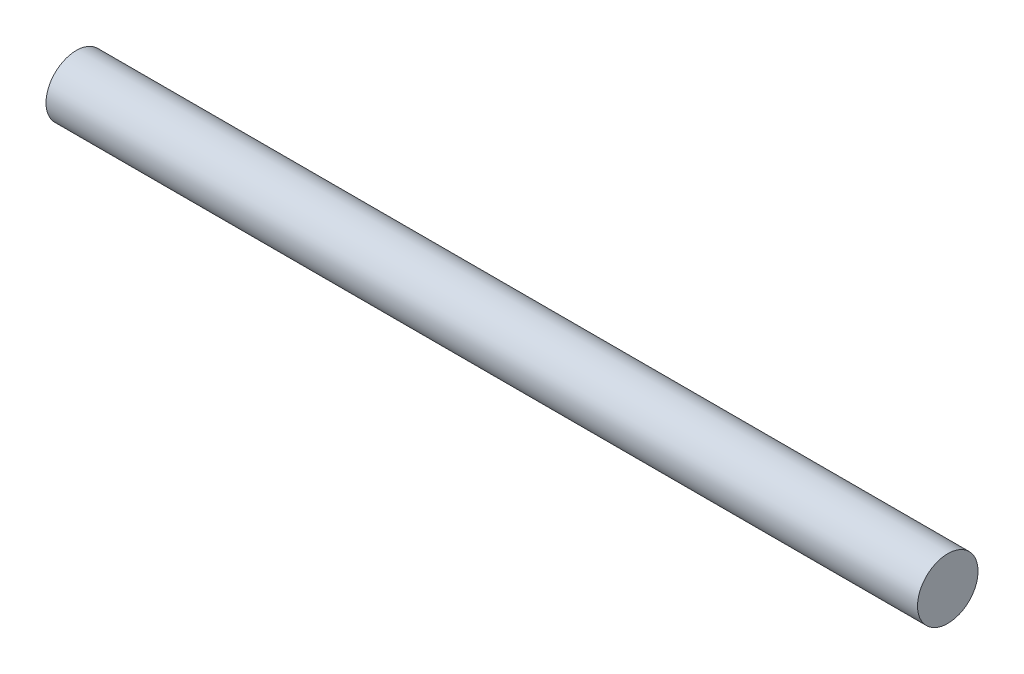
ISO-10303-21;
HEADER;
FILE_DESCRIPTION(('STEP AP214'),'2;1');
FILE_NAME('part.step','',(''),(''),'','','');
FILE_SCHEMA(('AUTOMOTIVE_DESIGN { 1 0 10303 214 1 1 1 1 }'));
ENDSEC;
DATA;
#1=APPLICATION_CONTEXT('core data for automotive mechanical design processes');
#2=APPLICATION_PROTOCOL_DEFINITION('international standard','automotive_design',2000,#1);
#3=PRODUCT_CONTEXT('',#1,'mechanical');
#4=PRODUCT('Part','Part','',(#3));
#5=PRODUCT_RELATED_PRODUCT_CATEGORY('part','',(#4));
#6=PRODUCT_DEFINITION_FORMATION('','',#4);
#7=PRODUCT_DEFINITION_CONTEXT('part definition',#1,'design');
#8=PRODUCT_DEFINITION('design','',#6,#7);
#9=PRODUCT_DEFINITION_SHAPE('','',#8);
#10=(LENGTH_UNIT() NAMED_UNIT(*) SI_UNIT(.MILLI.,.METRE.));
#11=(NAMED_UNIT(*) PLANE_ANGLE_UNIT() SI_UNIT($,.RADIAN.));
#12=(NAMED_UNIT(*) SI_UNIT($,.STERADIAN.) SOLID_ANGLE_UNIT());
#13=UNCERTAINTY_MEASURE_WITH_UNIT(LENGTH_MEASURE(1.E-05),#10,'distance_accuracy_value','');
#14=(GEOMETRIC_REPRESENTATION_CONTEXT(3) GLOBAL_UNCERTAINTY_ASSIGNED_CONTEXT((#13)) GLOBAL_UNIT_ASSIGNED_CONTEXT((#10,
#11,#12)) REPRESENTATION_CONTEXT('',''));
#15=CARTESIAN_POINT('',(0.,0.,0.));
#16=DIRECTION('',(0.,0.,1.));
#17=DIRECTION('',(1.,0.,0.));
#18=AXIS2_PLACEMENT_3D('',#15,#16,#17);
#19=CARTESIAN_POINT('',(720.,0.,0.));
#20=DIRECTION('',(-1.,0.,0.));
#21=DIRECTION('',(0.,0.,1.));
#22=AXIS2_PLACEMENT_3D('',#19,#20,#21);
#23=CYLINDRICAL_SURFACE('',#22,25.);
#24=CARTESIAN_POINT('',(720.,0.,0.));
#25=DIRECTION('',(1.,0.,0.));
#26=DIRECTION('',(0.,0.,-1.));
#27=AXIS2_PLACEMENT_3D('',#24,#25,#26);
#28=CIRCLE('',#27,25.);
#29=CARTESIAN_POINT('',(720.,0.,25.));
#30=VERTEX_POINT('',#29);
#31=EDGE_CURVE('E10',#30,#30,#28,.T.);
#32=CARTESIAN_POINT('',(0.,0.,0.));
#33=DIRECTION('',(1.,0.,0.));
#34=DIRECTION('',(0.,0.,-1.));
#35=AXIS2_PLACEMENT_3D('',#32,#33,#34);
#36=CIRCLE('',#35,25.);
#37=CARTESIAN_POINT('',(-1.11022302462516E-13,0.,25.));
#38=VERTEX_POINT('',#37);
#39=EDGE_CURVE('E36',#38,#38,#36,.T.);
#40=CARTESIAN_POINT('',(720.,0.,25.));
#41=CARTESIAN_POINT('',(712.5,0.,25.));
#42=CARTESIAN_POINT('',(705.,0.,25.));
#43=CARTESIAN_POINT('',(690.,0.,25.));
#44=CARTESIAN_POINT('',(682.5,0.,25.));
#45=CARTESIAN_POINT('',(667.5,0.,25.));
#46=CARTESIAN_POINT('',(660.,0.,25.));
#47=CARTESIAN_POINT('',(645.,0.,25.));
#48=CARTESIAN_POINT('',(637.5,0.,25.));
#49=CARTESIAN_POINT('',(622.5,0.,25.));
#50=CARTESIAN_POINT('',(615.,0.,25.));
#51=CARTESIAN_POINT('',(600.,0.,25.));
#52=CARTESIAN_POINT('',(592.5,0.,25.));
#53=CARTESIAN_POINT('',(577.5,0.,25.));
#54=CARTESIAN_POINT('',(570.,0.,25.));
#55=CARTESIAN_POINT('',(555.,0.,25.));
#56=CARTESIAN_POINT('',(547.5,0.,25.));
#57=CARTESIAN_POINT('',(532.5,0.,25.));
#58=CARTESIAN_POINT('',(525.,0.,25.));
#59=CARTESIAN_POINT('',(510.,0.,25.));
#60=CARTESIAN_POINT('',(502.5,0.,25.));
#61=CARTESIAN_POINT('',(487.5,0.,25.));
#62=CARTESIAN_POINT('',(480.,0.,25.));
#63=CARTESIAN_POINT('',(465.,0.,25.));
#64=CARTESIAN_POINT('',(457.5,0.,25.));
#65=CARTESIAN_POINT('',(442.5,0.,25.));
#66=CARTESIAN_POINT('',(435.,0.,25.));
#67=CARTESIAN_POINT('',(420.,0.,25.));
#68=CARTESIAN_POINT('',(412.5,0.,25.));
#69=CARTESIAN_POINT('',(397.5,0.,25.));
#70=CARTESIAN_POINT('',(390.,0.,25.));
#71=CARTESIAN_POINT('',(375.,0.,25.));
#72=CARTESIAN_POINT('',(367.5,0.,25.));
#73=CARTESIAN_POINT('',(352.5,0.,25.));
#74=CARTESIAN_POINT('',(345.,0.,25.));
#75=CARTESIAN_POINT('',(330.,0.,25.));
#76=CARTESIAN_POINT('',(322.5,0.,25.));
#77=CARTESIAN_POINT('',(307.5,0.,25.));
#78=CARTESIAN_POINT('',(300.,0.,25.));
#79=CARTESIAN_POINT('',(285.,0.,25.));
#80=CARTESIAN_POINT('',(277.5,0.,25.));
#81=CARTESIAN_POINT('',(262.5,0.,25.));
#82=CARTESIAN_POINT('',(255.,0.,25.));
#83=CARTESIAN_POINT('',(240.,0.,25.));
#84=CARTESIAN_POINT('',(232.5,0.,25.));
#85=CARTESIAN_POINT('',(217.5,0.,25.));
#86=CARTESIAN_POINT('',(210.,0.,25.));
#87=CARTESIAN_POINT('',(195.,0.,25.));
#88=CARTESIAN_POINT('',(187.5,0.,25.));
#89=CARTESIAN_POINT('',(172.5,0.,25.));
#90=CARTESIAN_POINT('',(165.,0.,25.));
#91=CARTESIAN_POINT('',(150.,0.,25.));
#92=CARTESIAN_POINT('',(142.5,0.,25.));
#93=CARTESIAN_POINT('',(127.5,0.,25.));
#94=CARTESIAN_POINT('',(120.,0.,25.));
#95=CARTESIAN_POINT('',(105.,0.,25.));
#96=CARTESIAN_POINT('',(97.5,0.,25.));
#97=CARTESIAN_POINT('',(82.4999999999999,0.,25.));
#98=CARTESIAN_POINT('',(74.9999999999999,0.,25.));
#99=CARTESIAN_POINT('',(59.9999999999999,0.,25.));
#100=CARTESIAN_POINT('',(52.4999999999999,0.,25.));
#101=CARTESIAN_POINT('',(37.4999999999999,0.,25.));
#102=CARTESIAN_POINT('',(29.9999999999999,0.,25.));
#103=CARTESIAN_POINT('',(14.9999999999999,0.,25.));
#104=CARTESIAN_POINT('',(7.49999999999989,0.,25.));
#105=CARTESIAN_POINT('',(-1.11022302462516E-13,0.,25.));
#106=B_SPLINE_CURVE_WITH_KNOTS('',3,(#40,#41,#42,#43,#44,#45,#46,#47,#48,#49,#50,#51,#52,#53,
#54,#55,#56,#57,#58,#59,#60,#61,#62,#63,#64,#65,#66,#67,#68,#69,#70,#71,#72,#73,#74,#75,#76,#77,
#78,#79,#80,#81,#82,#83,#84,#85,#86,#87,#88,#89,#90,#91,#92,#93,#94,#95,#96,#97,#98,#99,#100,
#101,#102,#103,#104,#105),.UNSPECIFIED.,.F.,.F.,(4,2,2,2,2,2,2,2,2,2,2,2,2,2,2,2,2,2,2,2,2,2,2,
2,2,2,2,2,2,2,2,2,4),(0.,22.5000000000001,45.,67.5000000000001,90.0000000000001,112.5,135.,
157.5,180.,202.5,225.,247.5,270.,292.5,315.,337.5,360.,382.5,405.,427.5,450.,472.5,495.,517.5,
540.,562.5,585.,607.5,630.,652.5,675.,697.5,720.),.UNSPECIFIED.);
#107=EDGE_CURVE('BSEAM33',#30,#38,#106,.T.);
#108=ORIENTED_EDGE('',*,*,#31,.F.);
#109=ORIENTED_EDGE('',*,*,#39,.T.);
#110=ORIENTED_EDGE('',*,*,#107,.T.);
#111=ORIENTED_EDGE('',*,*,#107,.F.);
#112=EDGE_LOOP('',(#108,#110,#109,#111));
#113=FACE_BOUND('',#112,.T.);
#114=ADVANCED_FACE('F33',(#113),#23,.T.);
#115=CARTESIAN_POINT('',(720.,0.,0.));
#116=DIRECTION('',(1.,0.,0.));
#117=DIRECTION('',(0.,0.,-1.));
#118=AXIS2_PLACEMENT_3D('',#115,#116,#117);
#119=PLANE('',#118);
#120=ORIENTED_EDGE('',*,*,#31,.T.);
#121=EDGE_LOOP('',(#120));
#122=FACE_BOUND('',#121,.T.);
#123=ADVANCED_FACE('F48',(#122),#119,.T.);
#124=CARTESIAN_POINT('',(0.,0.,0.));
#125=DIRECTION('',(1.,0.,0.));
#126=DIRECTION('',(0.,0.,-1.));
#127=AXIS2_PLACEMENT_3D('',#124,#125,#126);
#128=PLANE('',#127);
#129=ORIENTED_EDGE('',*,*,#39,.F.);
#130=EDGE_LOOP('',(#129));
#131=FACE_BOUND('',#130,.T.);
#132=ADVANCED_FACE('F46',(#131),#128,.F.);
#133=CLOSED_SHELL('',(#114,#123,#132));
#134=MANIFOLD_SOLID_BREP('B2',#133);
#135=ADVANCED_BREP_SHAPE_REPRESENTATION('',(#18,#134),#14);
#136=SHAPE_DEFINITION_REPRESENTATION(#9,#135);
ENDSEC;
END-ISO-10303-21;
